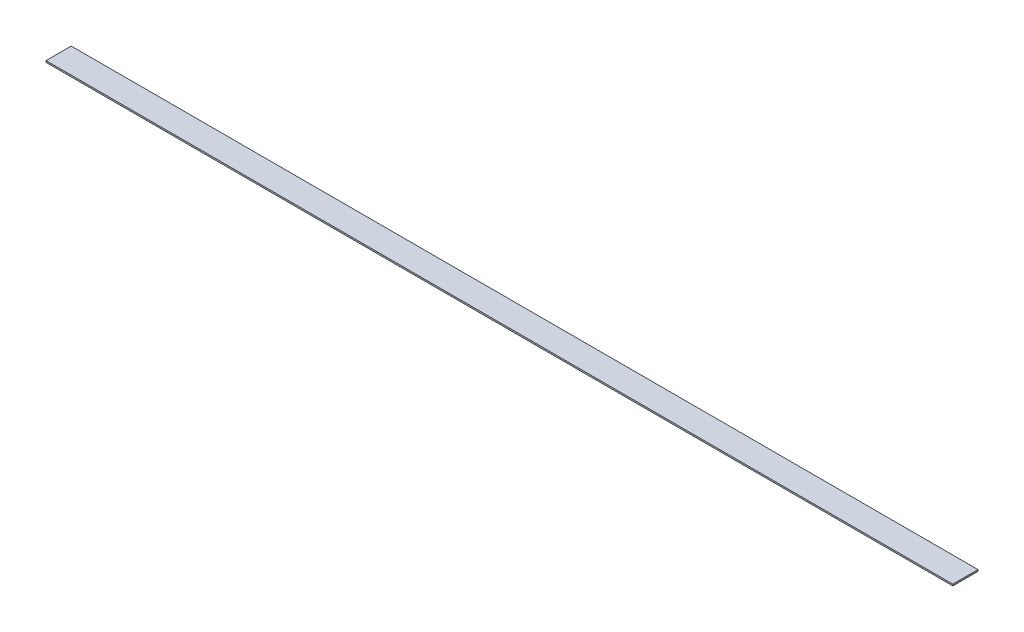
ISO-10303-21;
HEADER;
FILE_DESCRIPTION(('STEP AP214'),'2;1');
FILE_NAME('part.step','',(''),(''),'','','');
FILE_SCHEMA(('AUTOMOTIVE_DESIGN { 1 0 10303 214 1 1 1 1 }'));
ENDSEC;
DATA;
#1=APPLICATION_CONTEXT('core data for automotive mechanical design processes');
#2=APPLICATION_PROTOCOL_DEFINITION('international standard','automotive_design',2000,#1);
#3=PRODUCT_CONTEXT('',#1,'mechanical');
#4=PRODUCT('Part','Part','',(#3));
#5=PRODUCT_RELATED_PRODUCT_CATEGORY('part','',(#4));
#6=PRODUCT_DEFINITION_FORMATION('','',#4);
#7=PRODUCT_DEFINITION_CONTEXT('part definition',#1,'design');
#8=PRODUCT_DEFINITION('design','',#6,#7);
#9=PRODUCT_DEFINITION_SHAPE('','',#8);
#10=(LENGTH_UNIT() NAMED_UNIT(*) SI_UNIT(.MILLI.,.METRE.));
#11=(NAMED_UNIT(*) PLANE_ANGLE_UNIT() SI_UNIT($,.RADIAN.));
#12=(NAMED_UNIT(*) SI_UNIT($,.STERADIAN.) SOLID_ANGLE_UNIT());
#13=UNCERTAINTY_MEASURE_WITH_UNIT(LENGTH_MEASURE(1.E-05),#10,'distance_accuracy_value','');
#14=(GEOMETRIC_REPRESENTATION_CONTEXT(3) GLOBAL_UNCERTAINTY_ASSIGNED_CONTEXT((#13)) GLOBAL_UNIT_ASSIGNED_CONTEXT((#10,
#11,#12)) REPRESENTATION_CONTEXT('',''));
#15=CARTESIAN_POINT('',(0.,0.,0.));
#16=DIRECTION('',(0.,0.,1.));
#17=DIRECTION('',(1.,0.,0.));
#18=AXIS2_PLACEMENT_3D('',#15,#16,#17);
#19=CARTESIAN_POINT('',(0.,1.5875,0.));
#20=DIRECTION('',(1.,0.,0.));
#21=DIRECTION('',(0.,0.,-1.));
#22=AXIS2_PLACEMENT_3D('',#19,#20,#21);
#23=PLANE('',#22);
#24=DIRECTION('',(0.,0.,1.));
#25=VECTOR('',#24,1.);
#26=CARTESIAN_POINT('',(0.,0.,0.));
#27=LINE('',#26,#25);
#28=CARTESIAN_POINT('',(0.,0.,-25.4));
#29=VERTEX_POINT('',#28);
#30=CARTESIAN_POINT('',(0.,0.,0.));
#31=VERTEX_POINT('',#30);
#32=EDGE_CURVE('E99',#29,#31,#27,.T.);
#33=ORIENTED_EDGE('',*,*,#32,.T.);
#34=DIRECTION('',(0.,-1.,0.));
#35=VECTOR('',#34,1.);
#36=CARTESIAN_POINT('',(0.,1.5875,0.));
#37=LINE('',#36,#35);
#38=CARTESIAN_POINT('',(0.,1.5875,0.));
#39=VERTEX_POINT('',#38);
#40=EDGE_CURVE('E11',#39,#31,#37,.T.);
#41=ORIENTED_EDGE('',*,*,#40,.F.);
#42=DIRECTION('',(0.,0.,1.));
#43=VECTOR('',#42,1.);
#44=CARTESIAN_POINT('',(0.,1.5875,0.));
#45=LINE('',#44,#43);
#46=CARTESIAN_POINT('',(0.,1.5875,-25.4));
#47=VERTEX_POINT('',#46);
#48=EDGE_CURVE('E87',#47,#39,#45,.T.);
#49=ORIENTED_EDGE('',*,*,#48,.F.);
#50=DIRECTION('',(0.,-1.,0.));
#51=VECTOR('',#50,1.);
#52=CARTESIAN_POINT('',(0.,1.5875,-25.4));
#53=LINE('',#52,#51);
#54=EDGE_CURVE('E95',#47,#29,#53,.T.);
#55=ORIENTED_EDGE('',*,*,#54,.T.);
#56=EDGE_LOOP('',(#33,#41,#49,#55));
#57=FACE_BOUND('',#56,.T.);
#58=ADVANCED_FACE('F36',(#57),#23,.F.);
#59=CARTESIAN_POINT('',(0.,1.5875,0.));
#60=DIRECTION('',(0.,0.,-1.));
#61=DIRECTION('',(-1.,0.,0.));
#62=AXIS2_PLACEMENT_3D('',#59,#60,#61);
#63=PLANE('',#62);
#64=DIRECTION('',(1.,0.,0.));
#65=VECTOR('',#64,1.);
#66=CARTESIAN_POINT('',(0.,0.,0.));
#67=LINE('',#66,#65);
#68=CARTESIAN_POINT('',(914.4,0.,0.));
#69=VERTEX_POINT('',#68);
#70=EDGE_CURVE('E91',#31,#69,#67,.T.);
#71=ORIENTED_EDGE('',*,*,#70,.T.);
#72=DIRECTION('',(0.,-1.,0.));
#73=VECTOR('',#72,1.);
#74=CARTESIAN_POINT('',(914.4,1.5875,0.));
#75=LINE('',#74,#73);
#76=CARTESIAN_POINT('',(914.4,1.5875,0.));
#77=VERTEX_POINT('',#76);
#78=EDGE_CURVE('E44',#77,#69,#75,.T.);
#79=ORIENTED_EDGE('',*,*,#78,.F.);
#80=DIRECTION('',(1.,0.,0.));
#81=VECTOR('',#80,1.);
#82=CARTESIAN_POINT('',(0.,1.5875,0.));
#83=LINE('',#82,#81);
#84=EDGE_CURVE('E82',#39,#77,#83,.T.);
#85=ORIENTED_EDGE('',*,*,#84,.F.);
#86=ORIENTED_EDGE('',*,*,#40,.T.);
#87=EDGE_LOOP('',(#71,#79,#85,#86));
#88=FACE_BOUND('',#87,.T.);
#89=ADVANCED_FACE('F90',(#88),#63,.F.);
#90=CARTESIAN_POINT('',(914.4,1.5875,0.));
#91=DIRECTION('',(-1.,0.,0.));
#92=DIRECTION('',(0.,0.,1.));
#93=AXIS2_PLACEMENT_3D('',#90,#91,#92);
#94=PLANE('',#93);
#95=DIRECTION('',(0.,0.,-1.));
#96=VECTOR('',#95,1.);
#97=CARTESIAN_POINT('',(914.4,0.,0.));
#98=LINE('',#97,#96);
#99=CARTESIAN_POINT('',(914.4,0.,-25.4));
#100=VERTEX_POINT('',#99);
#101=EDGE_CURVE('E69',#69,#100,#98,.T.);
#102=ORIENTED_EDGE('',*,*,#101,.T.);
#103=DIRECTION('',(0.,-1.,0.));
#104=VECTOR('',#103,1.);
#105=CARTESIAN_POINT('',(914.4,1.5875,-25.4));
#106=LINE('',#105,#104);
#107=CARTESIAN_POINT('',(914.4,1.5875,-25.4));
#108=VERTEX_POINT('',#107);
#109=EDGE_CURVE('E92',#108,#100,#106,.T.);
#110=ORIENTED_EDGE('',*,*,#109,.F.);
#111=DIRECTION('',(0.,0.,-1.));
#112=VECTOR('',#111,1.);
#113=CARTESIAN_POINT('',(914.4,1.5875,0.));
#114=LINE('',#113,#112);
#115=EDGE_CURVE('E85',#77,#108,#114,.T.);
#116=ORIENTED_EDGE('',*,*,#115,.F.);
#117=ORIENTED_EDGE('',*,*,#78,.T.);
#118=EDGE_LOOP('',(#102,#110,#116,#117));
#119=FACE_BOUND('',#118,.T.);
#120=ADVANCED_FACE('F93',(#119),#94,.F.);
#121=CARTESIAN_POINT('',(0.,1.5875,-25.4));
#122=DIRECTION('',(0.,0.,1.));
#123=DIRECTION('',(1.,0.,0.));
#124=AXIS2_PLACEMENT_3D('',#121,#122,#123);
#125=PLANE('',#124);
#126=DIRECTION('',(-1.,0.,0.));
#127=VECTOR('',#126,1.);
#128=CARTESIAN_POINT('',(0.,0.,-25.4));
#129=LINE('',#128,#127);
#130=EDGE_CURVE('E75',#100,#29,#129,.T.);
#131=ORIENTED_EDGE('',*,*,#130,.T.);
#132=ORIENTED_EDGE('',*,*,#54,.F.);
#133=DIRECTION('',(-1.,0.,0.));
#134=VECTOR('',#133,1.);
#135=CARTESIAN_POINT('',(0.,1.5875,-25.4));
#136=LINE('',#135,#134);
#137=EDGE_CURVE('E52',#108,#47,#136,.T.);
#138=ORIENTED_EDGE('',*,*,#137,.F.);
#139=ORIENTED_EDGE('',*,*,#109,.T.);
#140=EDGE_LOOP('',(#131,#132,#138,#139));
#141=FACE_BOUND('',#140,.T.);
#142=ADVANCED_FACE('F106',(#141),#125,.F.);
#143=CARTESIAN_POINT('',(0.,1.5875,0.));
#144=DIRECTION('',(0.,-1.,0.));
#145=DIRECTION('',(0.,0.,-1.));
#146=AXIS2_PLACEMENT_3D('',#143,#144,#145);
#147=PLANE('',#146);
#148=ORIENTED_EDGE('',*,*,#48,.T.);
#149=ORIENTED_EDGE('',*,*,#84,.T.);
#150=ORIENTED_EDGE('',*,*,#115,.T.);
#151=ORIENTED_EDGE('',*,*,#137,.T.);
#152=EDGE_LOOP('',(#148,#149,#150,#151));
#153=FACE_BOUND('',#152,.T.);
#154=ADVANCED_FACE('F83',(#153),#147,.F.);
#155=CARTESIAN_POINT('',(0.,0.,0.));
#156=DIRECTION('',(0.,-1.,0.));
#157=DIRECTION('',(0.,0.,-1.));
#158=AXIS2_PLACEMENT_3D('',#155,#156,#157);
#159=PLANE('',#158);
#160=ORIENTED_EDGE('',*,*,#32,.F.);
#161=ORIENTED_EDGE('',*,*,#130,.F.);
#162=ORIENTED_EDGE('',*,*,#101,.F.);
#163=ORIENTED_EDGE('',*,*,#70,.F.);
#164=EDGE_LOOP('',(#160,#161,#162,#163));
#165=FACE_BOUND('',#164,.T.);
#166=ADVANCED_FACE('F109',(#165),#159,.T.);
#167=CLOSED_SHELL('',(#58,#89,#120,#142,#154,#166));
#168=MANIFOLD_SOLID_BREP('B2',#167);
#169=ADVANCED_BREP_SHAPE_REPRESENTATION('',(#18,#168),#14);
#170=SHAPE_DEFINITION_REPRESENTATION(#9,#169);
ENDSEC;
END-ISO-10303-21;
